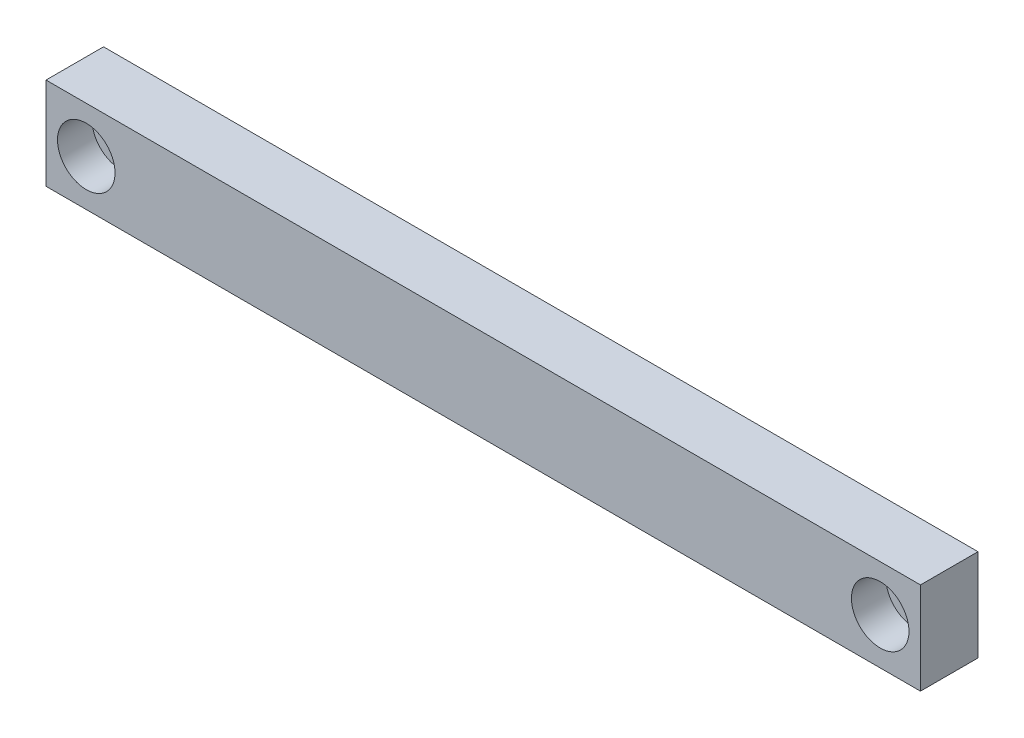
ISO-10303-21;
HEADER;
FILE_DESCRIPTION(('STEP AP214'),'2;1');
FILE_NAME('part.step','',(''),(''),'','','');
FILE_SCHEMA(('AUTOMOTIVE_DESIGN { 1 0 10303 214 1 1 1 1 }'));
ENDSEC;
DATA;
#1=APPLICATION_CONTEXT('core data for automotive mechanical design processes');
#2=APPLICATION_PROTOCOL_DEFINITION('international standard','automotive_design',2000,#1);
#3=PRODUCT_CONTEXT('',#1,'mechanical');
#4=PRODUCT('Part','Part','',(#3));
#5=PRODUCT_RELATED_PRODUCT_CATEGORY('part','',(#4));
#6=PRODUCT_DEFINITION_FORMATION('','',#4);
#7=PRODUCT_DEFINITION_CONTEXT('part definition',#1,'design');
#8=PRODUCT_DEFINITION('design','',#6,#7);
#9=PRODUCT_DEFINITION_SHAPE('','',#8);
#10=(LENGTH_UNIT() NAMED_UNIT(*) SI_UNIT(.MILLI.,.METRE.));
#11=(NAMED_UNIT(*) PLANE_ANGLE_UNIT() SI_UNIT($,.RADIAN.));
#12=(NAMED_UNIT(*) SI_UNIT($,.STERADIAN.) SOLID_ANGLE_UNIT());
#13=UNCERTAINTY_MEASURE_WITH_UNIT(LENGTH_MEASURE(1.E-05),#10,'distance_accuracy_value','');
#14=(GEOMETRIC_REPRESENTATION_CONTEXT(3) GLOBAL_UNCERTAINTY_ASSIGNED_CONTEXT((#13)) GLOBAL_UNIT_ASSIGNED_CONTEXT((#10,
#11,#12)) REPRESENTATION_CONTEXT('',''));
#15=CARTESIAN_POINT('',(0.,0.,0.));
#16=DIRECTION('',(0.,0.,1.));
#17=DIRECTION('',(1.,0.,0.));
#18=AXIS2_PLACEMENT_3D('',#15,#16,#17);
#19=CARTESIAN_POINT('',(34.5000000000002,0.,9.49999999999645));
#20=DIRECTION('',(0.,0.,-1.));
#21=DIRECTION('',(-1.,0.,0.));
#22=AXIS2_PLACEMENT_3D('',#19,#20,#21);
#23=CYLINDRICAL_SURFACE('',#22,1.5);
#24=CARTESIAN_POINT('',(34.5000000000002,0.,4.49999999999645));
#25=DIRECTION('',(0.,0.,1.));
#26=DIRECTION('',(-1.,0.,0.));
#27=AXIS2_PLACEMENT_3D('',#24,#25,#26);
#28=CIRCLE('',#27,1.5);
#29=CARTESIAN_POINT('',(33.0000000000002,0.,4.49999999999645));
#30=VERTEX_POINT('',#29);
#31=EDGE_CURVE('E137',#30,#30,#28,.T.);
#32=ORIENTED_EDGE('',*,*,#31,.F.);
#33=EDGE_LOOP('',(#32));
#34=FACE_BOUND('',#33,.T.);
#35=CARTESIAN_POINT('',(34.5000000000002,0.,6.49999999999645));
#36=DIRECTION('',(0.,0.,1.));
#37=DIRECTION('',(1.,0.,0.));
#38=AXIS2_PLACEMENT_3D('',#35,#36,#37);
#39=CIRCLE('',#38,1.5);
#40=CARTESIAN_POINT('',(36.0000000000002,0.,6.49999999999645));
#41=VERTEX_POINT('',#40);
#42=EDGE_CURVE('E113',#41,#41,#39,.T.);
#43=ORIENTED_EDGE('',*,*,#42,.T.);
#44=EDGE_LOOP('',(#43));
#45=FACE_BOUND('',#44,.T.);
#46=ADVANCED_FACE('F38',(#34,#45),#23,.F.);
#47=CARTESIAN_POINT('',(0.,0.,9.49999999999645));
#48=DIRECTION('',(0.,0.,-1.));
#49=DIRECTION('',(-1.,0.,0.));
#50=AXIS2_PLACEMENT_3D('',#47,#48,#49);
#51=PLANE('',#50);
#52=CARTESIAN_POINT('',(34.5000000000002,0.,9.49999999999645));
#53=DIRECTION('',(0.,0.,1.));
#54=DIRECTION('',(1.,0.,0.));
#55=AXIS2_PLACEMENT_3D('',#52,#53,#54);
#56=CIRCLE('',#55,2.5);
#57=CARTESIAN_POINT('',(37.0000000000002,0.,9.49999999999645));
#58=VERTEX_POINT('',#57);
#59=EDGE_CURVE('E121',#58,#58,#56,.T.);
#60=ORIENTED_EDGE('',*,*,#59,.F.);
#61=EDGE_LOOP('',(#60));
#62=FACE_BOUND('',#61,.T.);
#63=CARTESIAN_POINT('',(-34.5000000000002,0.,9.49999999999645));
#64=DIRECTION('',(0.,0.,1.));
#65=DIRECTION('',(-1.,0.,0.));
#66=AXIS2_PLACEMENT_3D('',#63,#64,#65);
#67=CIRCLE('',#66,2.5);
#68=CARTESIAN_POINT('',(-37.0000000000002,0.,9.49999999999645));
#69=VERTEX_POINT('',#68);
#70=EDGE_CURVE('E126',#69,#69,#67,.T.);
#71=ORIENTED_EDGE('',*,*,#70,.F.);
#72=EDGE_LOOP('',(#71));
#73=FACE_BOUND('',#72,.T.);
#74=DIRECTION('',(0.,-1.,0.));
#75=VECTOR('',#74,1.);
#76=CARTESIAN_POINT('',(-38.,-4.,9.49999999999645));
#77=LINE('',#76,#75);
#78=CARTESIAN_POINT('',(-38.,4.,9.49999999999645));
#79=VERTEX_POINT('',#78);
#80=CARTESIAN_POINT('',(-38.,-4.,9.49999999999645));
#81=VERTEX_POINT('',#80);
#82=EDGE_CURVE('E92',#79,#81,#77,.T.);
#83=ORIENTED_EDGE('',*,*,#82,.T.);
#84=DIRECTION('',(1.,0.,0.));
#85=VECTOR('',#84,1.);
#86=CARTESIAN_POINT('',(38.,-4.00000000000001,9.49999999999645));
#87=LINE('',#86,#85);
#88=CARTESIAN_POINT('',(38.,-4.00000000000001,9.49999999999645));
#89=VERTEX_POINT('',#88);
#90=EDGE_CURVE('E87',#81,#89,#87,.T.);
#91=ORIENTED_EDGE('',*,*,#90,.T.);
#92=DIRECTION('',(0.,1.,0.));
#93=VECTOR('',#92,1.);
#94=CARTESIAN_POINT('',(38.,3.99999999999999,9.49999999999645));
#95=LINE('',#94,#93);
#96=CARTESIAN_POINT('',(38.,3.99999999999999,9.49999999999645));
#97=VERTEX_POINT('',#96);
#98=EDGE_CURVE('E90',#89,#97,#95,.T.);
#99=ORIENTED_EDGE('',*,*,#98,.T.);
#100=DIRECTION('',(-1.,0.,0.));
#101=VECTOR('',#100,1.);
#102=CARTESIAN_POINT('',(-38.,4.,9.49999999999645));
#103=LINE('',#102,#101);
#104=EDGE_CURVE('E57',#97,#79,#103,.T.);
#105=ORIENTED_EDGE('',*,*,#104,.T.);
#106=EDGE_LOOP('',(#83,#91,#99,#105));
#107=FACE_BOUND('',#106,.T.);
#108=ADVANCED_FACE('F88',(#62,#73,#107),#51,.F.);
#109=CARTESIAN_POINT('',(0.,0.,4.49999999999645));
#110=DIRECTION('',(0.,0.,-1.));
#111=DIRECTION('',(-1.,0.,0.));
#112=AXIS2_PLACEMENT_3D('',#109,#110,#111);
#113=PLANE('',#112);
#114=CARTESIAN_POINT('',(4.4295170487909E-11,3.46111537324563E-11,4.49999999999645));
#115=DIRECTION('',(0.,0.,-1.));
#116=DIRECTION('',(-1.,0.,0.));
#117=AXIS2_PLACEMENT_3D('',#114,#115,#116);
#118=CIRCLE('',#117,3.0000000000324);
#119=CARTESIAN_POINT('',(-2.9999999999881,3.46111537324563E-11,4.49999999999645));
#120=VERTEX_POINT('',#119);
#121=EDGE_CURVE('E119',#120,#120,#118,.T.);
#122=ORIENTED_EDGE('',*,*,#121,.F.);
#123=EDGE_LOOP('',(#122));
#124=FACE_BOUND('',#123,.T.);
#125=CARTESIAN_POINT('',(-34.5000000000002,0.,4.49999999999645));
#126=DIRECTION('',(0.,0.,1.));
#127=DIRECTION('',(1.,0.,0.));
#128=AXIS2_PLACEMENT_3D('',#125,#126,#127);
#129=CIRCLE('',#128,1.5);
#130=CARTESIAN_POINT('',(-33.0000000000002,0.,4.49999999999645));
#131=VERTEX_POINT('',#130);
#132=EDGE_CURVE('E108',#131,#131,#129,.T.);
#133=ORIENTED_EDGE('',*,*,#132,.T.);
#134=EDGE_LOOP('',(#133));
#135=FACE_BOUND('',#134,.T.);
#136=DIRECTION('',(0.,-1.,0.));
#137=VECTOR('',#136,1.);
#138=CARTESIAN_POINT('',(-38.,-4.,4.49999999999645));
#139=LINE('',#138,#137);
#140=CARTESIAN_POINT('',(-38.,4.,4.49999999999645));
#141=VERTEX_POINT('',#140);
#142=CARTESIAN_POINT('',(-38.,-4.,4.49999999999645));
#143=VERTEX_POINT('',#142);
#144=EDGE_CURVE('E105',#141,#143,#139,.T.);
#145=ORIENTED_EDGE('',*,*,#144,.F.);
#146=DIRECTION('',(-1.,0.,0.));
#147=VECTOR('',#146,1.);
#148=CARTESIAN_POINT('',(-38.,4.,4.49999999999645));
#149=LINE('',#148,#147);
#150=CARTESIAN_POINT('',(38.,3.99999999999999,4.49999999999645));
#151=VERTEX_POINT('',#150);
#152=EDGE_CURVE('E80',#151,#141,#149,.T.);
#153=ORIENTED_EDGE('',*,*,#152,.F.);
#154=DIRECTION('',(0.,1.,0.));
#155=VECTOR('',#154,1.);
#156=CARTESIAN_POINT('',(38.,3.99999999999999,4.49999999999645));
#157=LINE('',#156,#155);
#158=CARTESIAN_POINT('',(38.,-4.00000000000001,4.49999999999645));
#159=VERTEX_POINT('',#158);
#160=EDGE_CURVE('E74',#159,#151,#157,.T.);
#161=ORIENTED_EDGE('',*,*,#160,.F.);
#162=DIRECTION('',(1.,0.,0.));
#163=VECTOR('',#162,1.);
#164=CARTESIAN_POINT('',(38.,-4.00000000000001,4.49999999999645));
#165=LINE('',#164,#163);
#166=EDGE_CURVE('E96',#143,#159,#165,.T.);
#167=ORIENTED_EDGE('',*,*,#166,.F.);
#168=EDGE_LOOP('',(#145,#153,#161,#167));
#169=FACE_BOUND('',#168,.T.);
#170=ORIENTED_EDGE('',*,*,#31,.T.);
#171=EDGE_LOOP('',(#170));
#172=FACE_BOUND('',#171,.T.);
#173=ADVANCED_FACE('F145',(#124,#135,#169,#172),#113,.T.);
#174=CARTESIAN_POINT('',(-38.,-4.,9.49999999999645));
#175=DIRECTION('',(1.,0.,0.));
#176=DIRECTION('',(0.,0.,-1.));
#177=AXIS2_PLACEMENT_3D('',#174,#175,#176);
#178=PLANE('',#177);
#179=ORIENTED_EDGE('',*,*,#144,.T.);
#180=DIRECTION('',(0.,0.,-1.));
#181=VECTOR('',#180,1.);
#182=CARTESIAN_POINT('',(-38.,-4.,9.49999999999645));
#183=LINE('',#182,#181);
#184=EDGE_CURVE('E11',#81,#143,#183,.T.);
#185=ORIENTED_EDGE('',*,*,#184,.F.);
#186=ORIENTED_EDGE('',*,*,#82,.F.);
#187=DIRECTION('',(0.,0.,-1.));
#188=VECTOR('',#187,1.);
#189=CARTESIAN_POINT('',(-38.,4.,9.49999999999645));
#190=LINE('',#189,#188);
#191=EDGE_CURVE('E101',#79,#141,#190,.T.);
#192=ORIENTED_EDGE('',*,*,#191,.T.);
#193=EDGE_LOOP('',(#179,#185,#186,#192));
#194=FACE_BOUND('',#193,.T.);
#195=ADVANCED_FACE('F40',(#194),#178,.F.);
#196=CARTESIAN_POINT('',(38.,-4.00000000000001,9.49999999999645));
#197=DIRECTION('',(0.,1.,0.));
#198=DIRECTION('',(-1.,0.,0.));
#199=AXIS2_PLACEMENT_3D('',#196,#197,#198);
#200=PLANE('',#199);
#201=ORIENTED_EDGE('',*,*,#166,.T.);
#202=DIRECTION('',(0.,0.,-1.));
#203=VECTOR('',#202,1.);
#204=CARTESIAN_POINT('',(38.,-4.00000000000001,9.49999999999645));
#205=LINE('',#204,#203);
#206=EDGE_CURVE('E48',#89,#159,#205,.T.);
#207=ORIENTED_EDGE('',*,*,#206,.F.);
#208=ORIENTED_EDGE('',*,*,#90,.F.);
#209=ORIENTED_EDGE('',*,*,#184,.T.);
#210=EDGE_LOOP('',(#201,#207,#208,#209));
#211=FACE_BOUND('',#210,.T.);
#212=ADVANCED_FACE('F95',(#211),#200,.F.);
#213=CARTESIAN_POINT('',(38.,3.99999999999999,9.49999999999645));
#214=DIRECTION('',(-1.,0.,0.));
#215=DIRECTION('',(0.,0.,1.));
#216=AXIS2_PLACEMENT_3D('',#213,#214,#215);
#217=PLANE('',#216);
#218=ORIENTED_EDGE('',*,*,#160,.T.);
#219=DIRECTION('',(0.,0.,-1.));
#220=VECTOR('',#219,1.);
#221=CARTESIAN_POINT('',(38.,3.99999999999999,9.49999999999645));
#222=LINE('',#221,#220);
#223=EDGE_CURVE('E97',#97,#151,#222,.T.);
#224=ORIENTED_EDGE('',*,*,#223,.F.);
#225=ORIENTED_EDGE('',*,*,#98,.F.);
#226=ORIENTED_EDGE('',*,*,#206,.T.);
#227=EDGE_LOOP('',(#218,#224,#225,#226));
#228=FACE_BOUND('',#227,.T.);
#229=ADVANCED_FACE('F99',(#228),#217,.F.);
#230=CARTESIAN_POINT('',(-38.,4.,9.49999999999645));
#231=DIRECTION('',(0.,-1.,0.));
#232=DIRECTION('',(1.,0.,0.));
#233=AXIS2_PLACEMENT_3D('',#230,#231,#232);
#234=PLANE('',#233);
#235=ORIENTED_EDGE('',*,*,#152,.T.);
#236=ORIENTED_EDGE('',*,*,#191,.F.);
#237=ORIENTED_EDGE('',*,*,#104,.F.);
#238=ORIENTED_EDGE('',*,*,#223,.T.);
#239=EDGE_LOOP('',(#235,#236,#237,#238));
#240=FACE_BOUND('',#239,.T.);
#241=ADVANCED_FACE('F151',(#240),#234,.F.);
#242=CARTESIAN_POINT('',(-34.5000000000002,0.,9.49999999999645));
#243=DIRECTION('',(0.,0.,-1.));
#244=DIRECTION('',(-1.,0.,0.));
#245=AXIS2_PLACEMENT_3D('',#242,#243,#244);
#246=CYLINDRICAL_SURFACE('',#245,1.5);
#247=CARTESIAN_POINT('',(-34.5000000000002,0.,6.49999999999645));
#248=DIRECTION('',(0.,0.,-1.));
#249=DIRECTION('',(-1.,0.,0.));
#250=AXIS2_PLACEMENT_3D('',#247,#248,#249);
#251=CIRCLE('',#250,1.5);
#252=CARTESIAN_POINT('',(-36.0000000000002,0.,6.49999999999645));
#253=VERTEX_POINT('',#252);
#254=EDGE_CURVE('E42',#253,#253,#251,.T.);
#255=ORIENTED_EDGE('',*,*,#254,.F.);
#256=EDGE_LOOP('',(#255));
#257=FACE_BOUND('',#256,.T.);
#258=ORIENTED_EDGE('',*,*,#132,.F.);
#259=EDGE_LOOP('',(#258));
#260=FACE_BOUND('',#259,.T.);
#261=ADVANCED_FACE('F148',(#257,#260),#246,.F.);
#262=CARTESIAN_POINT('',(4.4295170487909E-11,3.46111537324563E-11,7.49999999999645));
#263=DIRECTION('',(0.,0.,-1.));
#264=DIRECTION('',(-1.,0.,0.));
#265=AXIS2_PLACEMENT_3D('',#262,#263,#264);
#266=CYLINDRICAL_SURFACE('',#265,3.0000000000324);
#267=CARTESIAN_POINT('',(4.4295170487909E-11,3.46111537324563E-11,7.49999999999645));
#268=DIRECTION('',(0.,0.,-1.));
#269=DIRECTION('',(-1.,0.,0.));
#270=AXIS2_PLACEMENT_3D('',#267,#268,#269);
#271=CIRCLE('',#270,3.0000000000324);
#272=CARTESIAN_POINT('',(-2.9999999999881,3.46111537324563E-11,7.49999999999645));
#273=VERTEX_POINT('',#272);
#274=EDGE_CURVE('E134',#273,#273,#271,.T.);
#275=ORIENTED_EDGE('',*,*,#274,.F.);
#276=EDGE_LOOP('',(#275));
#277=FACE_BOUND('',#276,.T.);
#278=ORIENTED_EDGE('',*,*,#121,.T.);
#279=EDGE_LOOP('',(#278));
#280=FACE_BOUND('',#279,.T.);
#281=ADVANCED_FACE('F150',(#277,#280),#266,.F.);
#282=CARTESIAN_POINT('',(4.4295170487909E-11,3.46111537324563E-11,7.49999999999645));
#283=DIRECTION('',(0.,0.,-1.));
#284=DIRECTION('',(-1.,0.,0.));
#285=AXIS2_PLACEMENT_3D('',#282,#283,#284);
#286=PLANE('',#285);
#287=ORIENTED_EDGE('',*,*,#274,.T.);
#288=EDGE_LOOP('',(#287));
#289=FACE_BOUND('',#288,.T.);
#290=ADVANCED_FACE('F159',(#289),#286,.T.);
#291=CARTESIAN_POINT('',(34.5000000000002,0.,6.49999999999645));
#292=DIRECTION('',(0.,0.,1.));
#293=DIRECTION('',(1.,0.,0.));
#294=AXIS2_PLACEMENT_3D('',#291,#292,#293);
#295=CYLINDRICAL_SURFACE('',#294,2.5);
#296=CARTESIAN_POINT('',(34.5000000000002,0.,6.49999999999645));
#297=DIRECTION('',(0.,0.,1.));
#298=DIRECTION('',(1.,0.,0.));
#299=AXIS2_PLACEMENT_3D('',#296,#297,#298);
#300=CIRCLE('',#299,2.5);
#301=CARTESIAN_POINT('',(37.0000000000002,0.,6.49999999999645));
#302=VERTEX_POINT('',#301);
#303=EDGE_CURVE('E115',#302,#302,#300,.T.);
#304=ORIENTED_EDGE('',*,*,#303,.F.);
#305=EDGE_LOOP('',(#304));
#306=FACE_BOUND('',#305,.T.);
#307=ORIENTED_EDGE('',*,*,#59,.T.);
#308=EDGE_LOOP('',(#307));
#309=FACE_BOUND('',#308,.T.);
#310=ADVANCED_FACE('F176',(#306,#309),#295,.F.);
#311=CARTESIAN_POINT('',(34.5000000000002,0.,6.49999999999645));
#312=DIRECTION('',(0.,0.,1.));
#313=DIRECTION('',(1.,0.,0.));
#314=AXIS2_PLACEMENT_3D('',#311,#312,#313);
#315=PLANE('',#314);
#316=ORIENTED_EDGE('',*,*,#42,.F.);
#317=EDGE_LOOP('',(#316));
#318=FACE_BOUND('',#317,.T.);
#319=ORIENTED_EDGE('',*,*,#303,.T.);
#320=EDGE_LOOP('',(#319));
#321=FACE_BOUND('',#320,.T.);
#322=ADVANCED_FACE('F185',(#318,#321),#315,.T.);
#323=CARTESIAN_POINT('',(-34.5000000000002,0.,6.49999999999645));
#324=DIRECTION('',(0.,0.,1.));
#325=DIRECTION('',(1.,0.,0.));
#326=AXIS2_PLACEMENT_3D('',#323,#324,#325);
#327=CYLINDRICAL_SURFACE('',#326,2.5);
#328=CARTESIAN_POINT('',(-34.5000000000002,0.,6.49999999999645));
#329=DIRECTION('',(0.,0.,1.));
#330=DIRECTION('',(-1.,0.,0.));
#331=AXIS2_PLACEMENT_3D('',#328,#329,#330);
#332=CIRCLE('',#331,2.5);
#333=CARTESIAN_POINT('',(-37.0000000000002,0.,6.49999999999645));
#334=VERTEX_POINT('',#333);
#335=EDGE_CURVE('E131',#334,#334,#332,.T.);
#336=ORIENTED_EDGE('',*,*,#335,.F.);
#337=EDGE_LOOP('',(#336));
#338=FACE_BOUND('',#337,.T.);
#339=ORIENTED_EDGE('',*,*,#70,.T.);
#340=EDGE_LOOP('',(#339));
#341=FACE_BOUND('',#340,.T.);
#342=ADVANCED_FACE('F181',(#338,#341),#327,.F.);
#343=CARTESIAN_POINT('',(-34.5000000000002,0.,6.49999999999645));
#344=DIRECTION('',(0.,0.,-1.));
#345=DIRECTION('',(-1.,0.,0.));
#346=AXIS2_PLACEMENT_3D('',#343,#344,#345);
#347=PLANE('',#346);
#348=ORIENTED_EDGE('',*,*,#254,.T.);
#349=EDGE_LOOP('',(#348));
#350=FACE_BOUND('',#349,.T.);
#351=ORIENTED_EDGE('',*,*,#335,.T.);
#352=EDGE_LOOP('',(#351));
#353=FACE_BOUND('',#352,.T.);
#354=ADVANCED_FACE('F178',(#350,#353),#347,.F.);
#355=CLOSED_SHELL('',(#46,#108,#173,#195,#212,#229,#241,#261,#281,#290,#310,#322,#342,#354));
#356=MANIFOLD_SOLID_BREP('B2',#355);
#357=ADVANCED_BREP_SHAPE_REPRESENTATION('',(#18,#356),#14);
#358=SHAPE_DEFINITION_REPRESENTATION(#9,#357);
ENDSEC;
END-ISO-10303-21;
